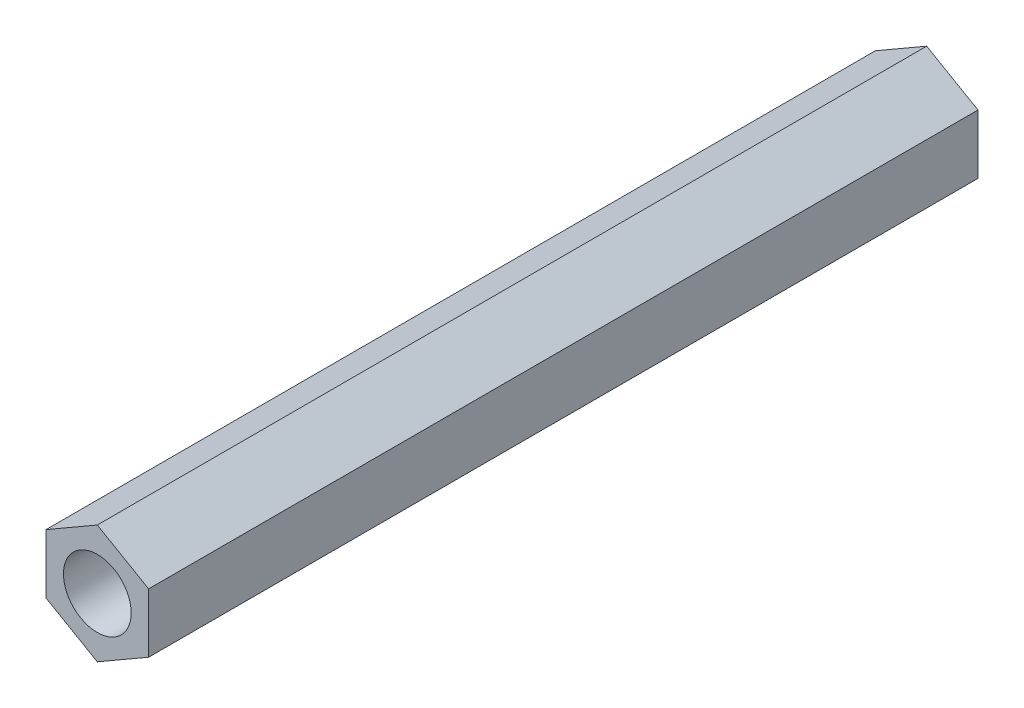
ISO-10303-21;
HEADER;
FILE_DESCRIPTION(('STEP AP214'),'2;1');
FILE_NAME('part.step','',(''),(''),'','','');
FILE_SCHEMA(('AUTOMOTIVE_DESIGN { 1 0 10303 214 1 1 1 1 }'));
ENDSEC;
DATA;
#1=APPLICATION_CONTEXT('core data for automotive mechanical design processes');
#2=APPLICATION_PROTOCOL_DEFINITION('international standard','automotive_design',2000,#1);
#3=PRODUCT_CONTEXT('',#1,'mechanical');
#4=PRODUCT('Part','Part','',(#3));
#5=PRODUCT_RELATED_PRODUCT_CATEGORY('part','',(#4));
#6=PRODUCT_DEFINITION_FORMATION('','',#4);
#7=PRODUCT_DEFINITION_CONTEXT('part definition',#1,'design');
#8=PRODUCT_DEFINITION('design','',#6,#7);
#9=PRODUCT_DEFINITION_SHAPE('','',#8);
#10=(LENGTH_UNIT() NAMED_UNIT(*) SI_UNIT(.MILLI.,.METRE.));
#11=(NAMED_UNIT(*) PLANE_ANGLE_UNIT() SI_UNIT($,.RADIAN.));
#12=(NAMED_UNIT(*) SI_UNIT($,.STERADIAN.) SOLID_ANGLE_UNIT());
#13=UNCERTAINTY_MEASURE_WITH_UNIT(LENGTH_MEASURE(1.E-05),#10,'distance_accuracy_value','');
#14=(GEOMETRIC_REPRESENTATION_CONTEXT(3) GLOBAL_UNCERTAINTY_ASSIGNED_CONTEXT((#13)) GLOBAL_UNIT_ASSIGNED_CONTEXT((#10,
#11,#12)) REPRESENTATION_CONTEXT('',''));
#15=CARTESIAN_POINT('',(0.,0.,0.));
#16=DIRECTION('',(0.,0.,1.));
#17=DIRECTION('',(1.,0.,0.));
#18=AXIS2_PLACEMENT_3D('',#15,#16,#17);
#19=CARTESIAN_POINT('',(0.,0.,49.));
#20=DIRECTION('',(0.,0.,1.));
#21=DIRECTION('',(1.,0.,0.));
#22=AXIS2_PLACEMENT_3D('',#19,#20,#21);
#23=PLANE('',#22);
#24=DIRECTION('',(0.866025403784439,0.5,0.));
#25=VECTOR('',#24,1.);
#26=CARTESIAN_POINT('',(0.,-3.5,49.));
#27=LINE('',#26,#25);
#28=CARTESIAN_POINT('',(0.,-3.5,49.));
#29=VERTEX_POINT('',#28);
#30=CARTESIAN_POINT('',(3.03108891324554,-1.75,49.));
#31=VERTEX_POINT('',#30);
#32=EDGE_CURVE('E131',#29,#31,#27,.T.);
#33=ORIENTED_EDGE('',*,*,#32,.T.);
#34=DIRECTION('',(0.,1.,0.));
#35=VECTOR('',#34,1.);
#36=CARTESIAN_POINT('',(3.03108891324554,-1.75,49.));
#37=LINE('',#36,#35);
#38=CARTESIAN_POINT('',(3.03108891324553,1.75,49.));
#39=VERTEX_POINT('',#38);
#40=EDGE_CURVE('E89',#31,#39,#37,.T.);
#41=ORIENTED_EDGE('',*,*,#40,.T.);
#42=DIRECTION('',(-0.866025403784439,0.5,0.));
#43=VECTOR('',#42,1.);
#44=CARTESIAN_POINT('',(3.03108891324553,1.75,49.));
#45=LINE('',#44,#43);
#46=CARTESIAN_POINT('',(0.,3.5,49.));
#47=VERTEX_POINT('',#46);
#48=EDGE_CURVE('E102',#39,#47,#45,.T.);
#49=ORIENTED_EDGE('',*,*,#48,.T.);
#50=DIRECTION('',(-0.866025403784439,-0.5,0.));
#51=VECTOR('',#50,1.);
#52=CARTESIAN_POINT('',(0.,3.5,49.));
#53=LINE('',#52,#51);
#54=CARTESIAN_POINT('',(-3.03108891324554,1.75,49.));
#55=VERTEX_POINT('',#54);
#56=EDGE_CURVE('E96',#47,#55,#53,.T.);
#57=ORIENTED_EDGE('',*,*,#56,.T.);
#58=DIRECTION('',(0.,-1.,0.));
#59=VECTOR('',#58,1.);
#60=CARTESIAN_POINT('',(-3.03108891324554,1.75,49.));
#61=LINE('',#60,#59);
#62=CARTESIAN_POINT('',(-3.03108891324554,-1.75,49.));
#63=VERTEX_POINT('',#62);
#64=EDGE_CURVE('E100',#55,#63,#61,.T.);
#65=ORIENTED_EDGE('',*,*,#64,.T.);
#66=DIRECTION('',(0.866025403784439,-0.5,0.));
#67=VECTOR('',#66,1.);
#68=CARTESIAN_POINT('',(-3.03108891324554,-1.75,49.));
#69=LINE('',#68,#67);
#70=EDGE_CURVE('E52',#63,#29,#69,.T.);
#71=ORIENTED_EDGE('',*,*,#70,.T.);
#72=EDGE_LOOP('',(#33,#41,#49,#57,#65,#71));
#73=FACE_BOUND('',#72,.T.);
#74=CARTESIAN_POINT('',(0.,0.,49.));
#75=DIRECTION('',(0.,0.,1.));
#76=DIRECTION('',(1.,0.,0.));
#77=AXIS2_PLACEMENT_3D('',#74,#75,#76);
#78=CIRCLE('',#77,2.);
#79=CARTESIAN_POINT('',(2.,0.,49.));
#80=VERTEX_POINT('',#79);
#81=EDGE_CURVE('E124',#80,#80,#78,.T.);
#82=ORIENTED_EDGE('',*,*,#81,.F.);
#83=EDGE_LOOP('',(#82));
#84=FACE_BOUND('',#83,.T.);
#85=ADVANCED_FACE('F35',(#73,#84),#23,.T.);
#86=CARTESIAN_POINT('',(0.,0.,0.));
#87=DIRECTION('',(0.,0.,1.));
#88=DIRECTION('',(1.,0.,0.));
#89=AXIS2_PLACEMENT_3D('',#86,#87,#88);
#90=PLANE('',#89);
#91=DIRECTION('',(0.866025403784439,0.5,0.));
#92=VECTOR('',#91,1.);
#93=CARTESIAN_POINT('',(0.,-3.5,0.));
#94=LINE('',#93,#92);
#95=CARTESIAN_POINT('',(0.,-3.5,0.));
#96=VERTEX_POINT('',#95);
#97=CARTESIAN_POINT('',(3.03108891324554,-1.75,0.));
#98=VERTEX_POINT('',#97);
#99=EDGE_CURVE('E120',#96,#98,#94,.T.);
#100=ORIENTED_EDGE('',*,*,#99,.F.);
#101=DIRECTION('',(0.866025403784439,-0.5,0.));
#102=VECTOR('',#101,1.);
#103=CARTESIAN_POINT('',(-3.03108891324554,-1.75,0.));
#104=LINE('',#103,#102);
#105=CARTESIAN_POINT('',(-3.03108891324554,-1.75,0.));
#106=VERTEX_POINT('',#105);
#107=EDGE_CURVE('E81',#106,#96,#104,.T.);
#108=ORIENTED_EDGE('',*,*,#107,.F.);
#109=DIRECTION('',(0.,-1.,0.));
#110=VECTOR('',#109,1.);
#111=CARTESIAN_POINT('',(-3.03108891324554,1.75,0.));
#112=LINE('',#111,#110);
#113=CARTESIAN_POINT('',(-3.03108891324554,1.75,0.));
#114=VERTEX_POINT('',#113);
#115=EDGE_CURVE('E75',#114,#106,#112,.T.);
#116=ORIENTED_EDGE('',*,*,#115,.F.);
#117=DIRECTION('',(-0.866025403784439,-0.5,0.));
#118=VECTOR('',#117,1.);
#119=CARTESIAN_POINT('',(0.,3.5,0.));
#120=LINE('',#119,#118);
#121=CARTESIAN_POINT('',(0.,3.5,0.));
#122=VERTEX_POINT('',#121);
#123=EDGE_CURVE('E110',#122,#114,#120,.T.);
#124=ORIENTED_EDGE('',*,*,#123,.F.);
#125=DIRECTION('',(-0.866025403784439,0.5,0.));
#126=VECTOR('',#125,1.);
#127=CARTESIAN_POINT('',(3.03108891324553,1.75,0.));
#128=LINE('',#127,#126);
#129=CARTESIAN_POINT('',(3.03108891324553,1.75,0.));
#130=VERTEX_POINT('',#129);
#131=EDGE_CURVE('E126',#130,#122,#128,.T.);
#132=ORIENTED_EDGE('',*,*,#131,.F.);
#133=DIRECTION('',(0.,1.,0.));
#134=VECTOR('',#133,1.);
#135=CARTESIAN_POINT('',(3.03108891324554,-1.75,0.));
#136=LINE('',#135,#134);
#137=EDGE_CURVE('E123',#98,#130,#136,.T.);
#138=ORIENTED_EDGE('',*,*,#137,.F.);
#139=EDGE_LOOP('',(#100,#108,#116,#124,#132,#138));
#140=FACE_BOUND('',#139,.T.);
#141=CARTESIAN_POINT('',(0.,0.,0.));
#142=DIRECTION('',(0.,0.,1.));
#143=DIRECTION('',(1.,0.,0.));
#144=AXIS2_PLACEMENT_3D('',#141,#142,#143);
#145=CIRCLE('',#144,2.);
#146=CARTESIAN_POINT('',(2.,0.,0.));
#147=VERTEX_POINT('',#146);
#148=EDGE_CURVE('E224',#147,#147,#145,.T.);
#149=ORIENTED_EDGE('',*,*,#148,.T.);
#150=EDGE_LOOP('',(#149));
#151=FACE_BOUND('',#150,.T.);
#152=ADVANCED_FACE('F140',(#140,#151),#90,.F.);
#153=CARTESIAN_POINT('',(0.,-3.5,49.));
#154=DIRECTION('',(-0.5,0.866025403784439,0.));
#155=DIRECTION('',(-0.866025403784439,-0.5,0.));
#156=AXIS2_PLACEMENT_3D('',#153,#154,#155);
#157=PLANE('',#156);
#158=ORIENTED_EDGE('',*,*,#99,.T.);
#159=DIRECTION('',(0.,0.,-1.));
#160=VECTOR('',#159,1.);
#161=CARTESIAN_POINT('',(3.03108891324554,-1.75,49.));
#162=LINE('',#161,#160);
#163=EDGE_CURVE('E11',#31,#98,#162,.T.);
#164=ORIENTED_EDGE('',*,*,#163,.F.);
#165=ORIENTED_EDGE('',*,*,#32,.F.);
#166=DIRECTION('',(0.,0.,-1.));
#167=VECTOR('',#166,1.);
#168=CARTESIAN_POINT('',(0.,-3.5,49.));
#169=LINE('',#168,#167);
#170=EDGE_CURVE('E116',#29,#96,#169,.T.);
#171=ORIENTED_EDGE('',*,*,#170,.T.);
#172=EDGE_LOOP('',(#158,#164,#165,#171));
#173=FACE_BOUND('',#172,.T.);
#174=ADVANCED_FACE('F37',(#173),#157,.F.);
#175=CARTESIAN_POINT('',(3.03108891324554,-1.75,49.));
#176=DIRECTION('',(-1.,0.,0.));
#177=DIRECTION('',(0.,-1.,0.));
#178=AXIS2_PLACEMENT_3D('',#175,#176,#177);
#179=PLANE('',#178);
#180=ORIENTED_EDGE('',*,*,#137,.T.);
#181=DIRECTION('',(0.,0.,-1.));
#182=VECTOR('',#181,1.);
#183=CARTESIAN_POINT('',(3.03108891324553,1.75,49.));
#184=LINE('',#183,#182);
#185=EDGE_CURVE('E44',#39,#130,#184,.T.);
#186=ORIENTED_EDGE('',*,*,#185,.F.);
#187=ORIENTED_EDGE('',*,*,#40,.F.);
#188=ORIENTED_EDGE('',*,*,#163,.T.);
#189=EDGE_LOOP('',(#180,#186,#187,#188));
#190=FACE_BOUND('',#189,.T.);
#191=ADVANCED_FACE('F165',(#190),#179,.F.);
#192=CARTESIAN_POINT('',(3.03108891324553,1.75,49.));
#193=DIRECTION('',(-0.5,-0.866025403784439,0.));
#194=DIRECTION('',(0.866025403784439,-0.5,0.));
#195=AXIS2_PLACEMENT_3D('',#192,#193,#194);
#196=PLANE('',#195);
#197=ORIENTED_EDGE('',*,*,#131,.T.);
#198=DIRECTION('',(0.,0.,-1.));
#199=VECTOR('',#198,1.);
#200=CARTESIAN_POINT('',(0.,3.5,49.));
#201=LINE('',#200,#199);
#202=EDGE_CURVE('E111',#47,#122,#201,.T.);
#203=ORIENTED_EDGE('',*,*,#202,.F.);
#204=ORIENTED_EDGE('',*,*,#48,.F.);
#205=ORIENTED_EDGE('',*,*,#185,.T.);
#206=EDGE_LOOP('',(#197,#203,#204,#205));
#207=FACE_BOUND('',#206,.T.);
#208=ADVANCED_FACE('F137',(#207),#196,.F.);
#209=CARTESIAN_POINT('',(0.,3.5,49.));
#210=DIRECTION('',(0.5,-0.866025403784439,0.));
#211=DIRECTION('',(0.866025403784439,0.5,0.));
#212=AXIS2_PLACEMENT_3D('',#209,#210,#211);
#213=PLANE('',#212);
#214=ORIENTED_EDGE('',*,*,#123,.T.);
#215=DIRECTION('',(0.,0.,-1.));
#216=VECTOR('',#215,1.);
#217=CARTESIAN_POINT('',(-3.03108891324554,1.75,49.));
#218=LINE('',#217,#216);
#219=EDGE_CURVE('E107',#55,#114,#218,.T.);
#220=ORIENTED_EDGE('',*,*,#219,.F.);
#221=ORIENTED_EDGE('',*,*,#56,.F.);
#222=ORIENTED_EDGE('',*,*,#202,.T.);
#223=EDGE_LOOP('',(#214,#220,#221,#222));
#224=FACE_BOUND('',#223,.T.);
#225=ADVANCED_FACE('F108',(#224),#213,.F.);
#226=CARTESIAN_POINT('',(-3.03108891324554,1.75,49.));
#227=DIRECTION('',(1.,0.,0.));
#228=DIRECTION('',(0.,0.,-1.));
#229=AXIS2_PLACEMENT_3D('',#226,#227,#228);
#230=PLANE('',#229);
#231=ORIENTED_EDGE('',*,*,#115,.T.);
#232=DIRECTION('',(0.,0.,-1.));
#233=VECTOR('',#232,1.);
#234=CARTESIAN_POINT('',(-3.03108891324554,-1.75,49.));
#235=LINE('',#234,#233);
#236=EDGE_CURVE('E112',#63,#106,#235,.T.);
#237=ORIENTED_EDGE('',*,*,#236,.F.);
#238=ORIENTED_EDGE('',*,*,#64,.F.);
#239=ORIENTED_EDGE('',*,*,#219,.T.);
#240=EDGE_LOOP('',(#231,#237,#238,#239));
#241=FACE_BOUND('',#240,.T.);
#242=ADVANCED_FACE('F114',(#241),#230,.F.);
#243=CARTESIAN_POINT('',(-3.03108891324554,-1.75,49.));
#244=DIRECTION('',(0.5,0.866025403784439,0.));
#245=DIRECTION('',(-0.866025403784439,0.5,0.));
#246=AXIS2_PLACEMENT_3D('',#243,#244,#245);
#247=PLANE('',#246);
#248=ORIENTED_EDGE('',*,*,#107,.T.);
#249=ORIENTED_EDGE('',*,*,#170,.F.);
#250=ORIENTED_EDGE('',*,*,#70,.F.);
#251=ORIENTED_EDGE('',*,*,#236,.T.);
#252=EDGE_LOOP('',(#248,#249,#250,#251));
#253=FACE_BOUND('',#252,.T.);
#254=ADVANCED_FACE('F145',(#253),#247,.F.);
#255=CARTESIAN_POINT('',(0.,0.,49.));
#256=DIRECTION('',(0.,0.,-1.));
#257=DIRECTION('',(-1.,0.,0.));
#258=AXIS2_PLACEMENT_3D('',#255,#256,#257);
#259=CYLINDRICAL_SURFACE('',#258,2.);
#260=ORIENTED_EDGE('',*,*,#81,.T.);
#261=EDGE_LOOP('',(#260));
#262=FACE_BOUND('',#261,.T.);
#263=ORIENTED_EDGE('',*,*,#148,.F.);
#264=EDGE_LOOP('',(#263));
#265=FACE_BOUND('',#264,.T.);
#266=ADVANCED_FACE('F147',(#262,#265),#259,.F.);
#267=CLOSED_SHELL('',(#85,#152,#174,#191,#208,#225,#242,#254,#266));
#268=MANIFOLD_SOLID_BREP('B2',#267);
#269=ADVANCED_BREP_SHAPE_REPRESENTATION('',(#18,#268),#14);
#270=SHAPE_DEFINITION_REPRESENTATION(#9,#269);
ENDSEC;
END-ISO-10303-21;
